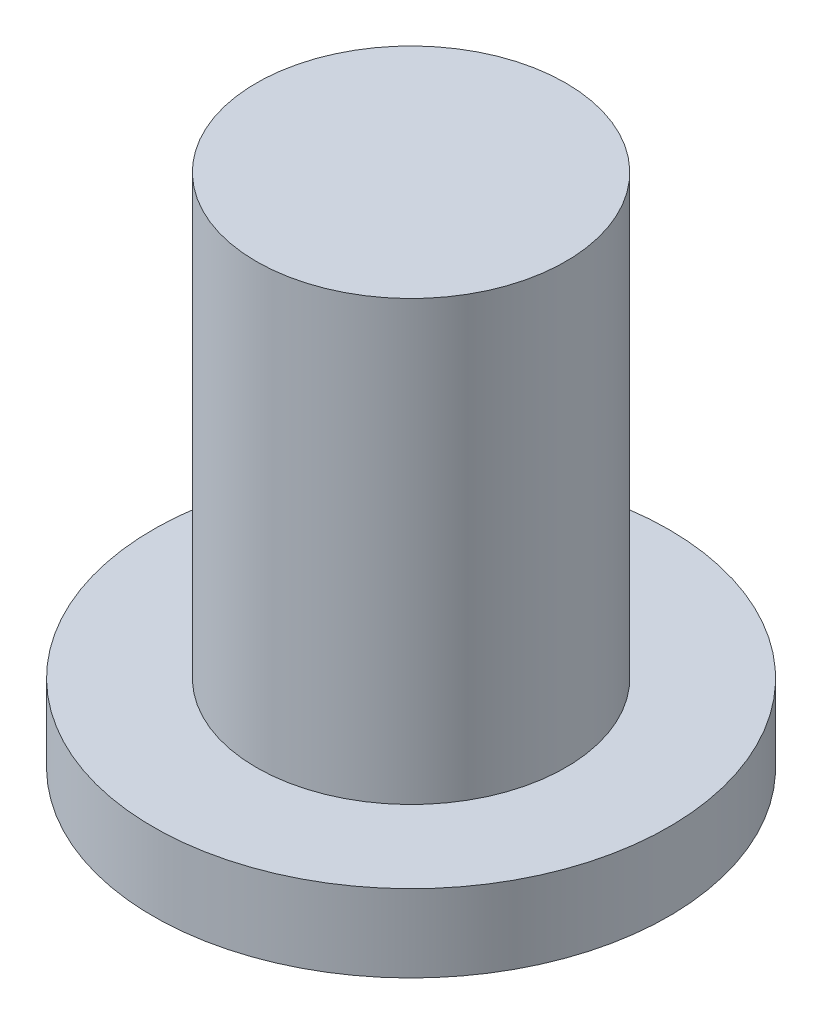
ISO-10303-21;
HEADER;
FILE_DESCRIPTION(('STEP AP214'),'2;1');
FILE_NAME('part.step','',(''),(''),'','','');
FILE_SCHEMA(('AUTOMOTIVE_DESIGN { 1 0 10303 214 1 1 1 1 }'));
ENDSEC;
DATA;
#1=APPLICATION_CONTEXT('core data for automotive mechanical design processes');
#2=APPLICATION_PROTOCOL_DEFINITION('international standard','automotive_design',2000,#1);
#3=PRODUCT_CONTEXT('',#1,'mechanical');
#4=PRODUCT('Part','Part','',(#3));
#5=PRODUCT_RELATED_PRODUCT_CATEGORY('part','',(#4));
#6=PRODUCT_DEFINITION_FORMATION('','',#4);
#7=PRODUCT_DEFINITION_CONTEXT('part definition',#1,'design');
#8=PRODUCT_DEFINITION('design','',#6,#7);
#9=PRODUCT_DEFINITION_SHAPE('','',#8);
#10=(LENGTH_UNIT() NAMED_UNIT(*) SI_UNIT(.MILLI.,.METRE.));
#11=(NAMED_UNIT(*) PLANE_ANGLE_UNIT() SI_UNIT($,.RADIAN.));
#12=(NAMED_UNIT(*) SI_UNIT($,.STERADIAN.) SOLID_ANGLE_UNIT());
#13=UNCERTAINTY_MEASURE_WITH_UNIT(LENGTH_MEASURE(1.E-05),#10,'distance_accuracy_value','');
#14=(GEOMETRIC_REPRESENTATION_CONTEXT(3) GLOBAL_UNCERTAINTY_ASSIGNED_CONTEXT((#13)) GLOBAL_UNIT_ASSIGNED_CONTEXT((#10,
#11,#12)) REPRESENTATION_CONTEXT('',''));
#15=CARTESIAN_POINT('',(0.,0.,0.));
#16=DIRECTION('',(0.,0.,1.));
#17=DIRECTION('',(1.,0.,0.));
#18=AXIS2_PLACEMENT_3D('',#15,#16,#17);
#19=CARTESIAN_POINT('',(0.,17.,0.));
#20=DIRECTION('',(0.,-1.,0.));
#21=DIRECTION('',(0.,0.,-1.));
#22=AXIS2_PLACEMENT_3D('',#19,#20,#21);
#23=CYLINDRICAL_SURFACE('',#22,6.);
#24=CARTESIAN_POINT('',(0.,17.,0.));
#25=DIRECTION('',(0.,1.,0.));
#26=DIRECTION('',(0.,0.,1.));
#27=AXIS2_PLACEMENT_3D('',#24,#25,#26);
#28=CIRCLE('',#27,6.);
#29=CARTESIAN_POINT('',(0.,17.,6.));
#30=VERTEX_POINT('',#29);
#31=EDGE_CURVE('E10',#30,#30,#28,.T.);
#32=ORIENTED_EDGE('',*,*,#31,.F.);
#33=EDGE_LOOP('',(#32));
#34=FACE_BOUND('',#33,.T.);
#35=CARTESIAN_POINT('',(0.,0.,0.));
#36=DIRECTION('',(0.,1.,0.));
#37=DIRECTION('',(0.,0.,1.));
#38=AXIS2_PLACEMENT_3D('',#35,#36,#37);
#39=CIRCLE('',#38,6.);
#40=CARTESIAN_POINT('',(0.,0.,6.));
#41=VERTEX_POINT('',#40);
#42=EDGE_CURVE('E40',#41,#41,#39,.T.);
#43=ORIENTED_EDGE('',*,*,#42,.T.);
#44=EDGE_LOOP('',(#43));
#45=FACE_BOUND('',#44,.T.);
#46=ADVANCED_FACE('F37',(#34,#45),#23,.T.);
#47=CARTESIAN_POINT('',(0.,17.,0.));
#48=DIRECTION('',(0.,1.,0.));
#49=DIRECTION('',(0.,0.,1.));
#50=AXIS2_PLACEMENT_3D('',#47,#48,#49);
#51=PLANE('',#50);
#52=ORIENTED_EDGE('',*,*,#31,.T.);
#53=EDGE_LOOP('',(#52));
#54=FACE_BOUND('',#53,.T.);
#55=ADVANCED_FACE('F60',(#54),#51,.T.);
#56=CARTESIAN_POINT('',(0.,-3.,0.));
#57=DIRECTION('',(0.,1.,0.));
#58=DIRECTION('',(0.,0.,1.));
#59=AXIS2_PLACEMENT_3D('',#56,#57,#58);
#60=CYLINDRICAL_SURFACE('',#59,10.);
#61=CARTESIAN_POINT('',(0.,-3.,0.));
#62=DIRECTION('',(0.,-1.,0.));
#63=DIRECTION('',(0.,0.,-1.));
#64=AXIS2_PLACEMENT_3D('',#61,#62,#63);
#65=CIRCLE('',#64,10.);
#66=CARTESIAN_POINT('',(0.,-3.,-10.));
#67=VERTEX_POINT('',#66);
#68=EDGE_CURVE('E47',#67,#67,#65,.T.);
#69=ORIENTED_EDGE('',*,*,#68,.F.);
#70=EDGE_LOOP('',(#69));
#71=FACE_BOUND('',#70,.T.);
#72=CARTESIAN_POINT('',(0.,0.,0.));
#73=DIRECTION('',(0.,-1.,0.));
#74=DIRECTION('',(0.,0.,-1.));
#75=AXIS2_PLACEMENT_3D('',#72,#73,#74);
#76=CIRCLE('',#75,10.);
#77=CARTESIAN_POINT('',(0.,0.,-10.));
#78=VERTEX_POINT('',#77);
#79=EDGE_CURVE('E49',#78,#78,#76,.T.);
#80=ORIENTED_EDGE('',*,*,#79,.T.);
#81=EDGE_LOOP('',(#80));
#82=FACE_BOUND('',#81,.T.);
#83=ADVANCED_FACE('F57',(#71,#82),#60,.T.);
#84=CARTESIAN_POINT('',(0.,-3.,0.));
#85=DIRECTION('',(0.,-1.,0.));
#86=DIRECTION('',(0.,0.,-1.));
#87=AXIS2_PLACEMENT_3D('',#84,#85,#86);
#88=PLANE('',#87);
#89=ORIENTED_EDGE('',*,*,#68,.T.);
#90=EDGE_LOOP('',(#89));
#91=FACE_BOUND('',#90,.T.);
#92=ADVANCED_FACE('F55',(#91),#88,.T.);
#93=CARTESIAN_POINT('',(0.,0.,0.));
#94=DIRECTION('',(0.,-1.,0.));
#95=DIRECTION('',(0.,0.,-1.));
#96=AXIS2_PLACEMENT_3D('',#93,#94,#95);
#97=PLANE('',#96);
#98=ORIENTED_EDGE('',*,*,#42,.F.);
#99=EDGE_LOOP('',(#98));
#100=FACE_BOUND('',#99,.T.);
#101=ORIENTED_EDGE('',*,*,#79,.F.);
#102=EDGE_LOOP('',(#101));
#103=FACE_BOUND('',#102,.T.);
#104=ADVANCED_FACE('F64',(#100,#103),#97,.F.);
#105=CLOSED_SHELL('',(#46,#55,#83,#92,#104));
#106=MANIFOLD_SOLID_BREP('B2',#105);
#107=ADVANCED_BREP_SHAPE_REPRESENTATION('',(#18,#106),#14);
#108=SHAPE_DEFINITION_REPRESENTATION(#9,#107);
ENDSEC;
END-ISO-10303-21;
